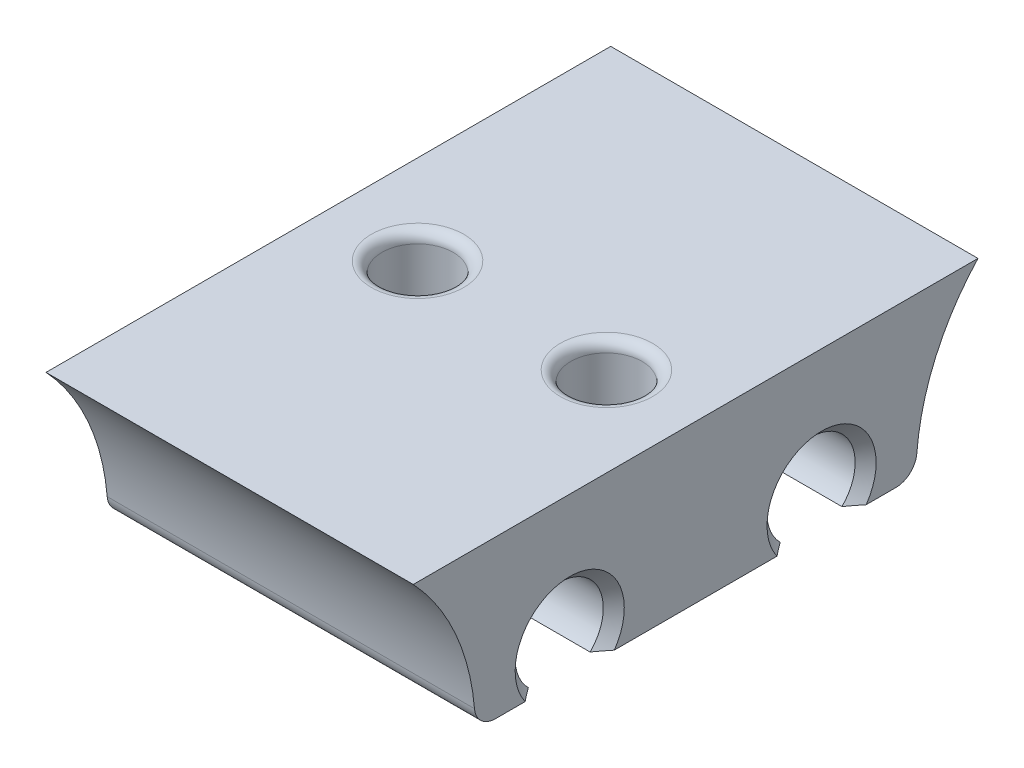
ISO-10303-21;
HEADER;
FILE_DESCRIPTION(('STEP AP214'),'2;1');
FILE_NAME('part.step','',(''),(''),'','','');
FILE_SCHEMA(('AUTOMOTIVE_DESIGN { 1 0 10303 214 1 1 1 1 }'));
ENDSEC;
DATA;
#1=APPLICATION_CONTEXT('core data for automotive mechanical design processes');
#2=APPLICATION_PROTOCOL_DEFINITION('international standard','automotive_design',2000,#1);
#3=PRODUCT_CONTEXT('',#1,'mechanical');
#4=PRODUCT('Part','Part','',(#3));
#5=PRODUCT_RELATED_PRODUCT_CATEGORY('part','',(#4));
#6=PRODUCT_DEFINITION_FORMATION('','',#4);
#7=PRODUCT_DEFINITION_CONTEXT('part definition',#1,'design');
#8=PRODUCT_DEFINITION('design','',#6,#7);
#9=PRODUCT_DEFINITION_SHAPE('','',#8);
#10=(LENGTH_UNIT() NAMED_UNIT(*) SI_UNIT(.MILLI.,.METRE.));
#11=(NAMED_UNIT(*) PLANE_ANGLE_UNIT() SI_UNIT($,.RADIAN.));
#12=(NAMED_UNIT(*) SI_UNIT($,.STERADIAN.) SOLID_ANGLE_UNIT());
#13=UNCERTAINTY_MEASURE_WITH_UNIT(LENGTH_MEASURE(1.E-05),#10,'distance_accuracy_value','');
#14=(GEOMETRIC_REPRESENTATION_CONTEXT(3) GLOBAL_UNCERTAINTY_ASSIGNED_CONTEXT((#13)) GLOBAL_UNIT_ASSIGNED_CONTEXT((#10,
#11,#12)) REPRESENTATION_CONTEXT('',''));
#15=CARTESIAN_POINT('',(0.,0.,0.));
#16=DIRECTION('',(0.,0.,1.));
#17=DIRECTION('',(1.,0.,0.));
#18=AXIS2_PLACEMENT_3D('',#15,#16,#17);
#19=CARTESIAN_POINT('',(8.75,-4.25,10.5));
#20=DIRECTION('',(-1.,0.,0.));
#21=DIRECTION('',(0.,0.,1.));
#22=AXIS2_PLACEMENT_3D('',#19,#20,#21);
#23=PLANE('',#22);
#24=DIRECTION('',(0.,0.,-1.));
#25=VECTOR('',#24,1.);
#26=CARTESIAN_POINT('',(8.75,-3.25,10.5));
#27=LINE('',#26,#25);
#28=CARTESIAN_POINT('',(8.75,-3.25,-8.12367605815953));
#29=VERTEX_POINT('',#28);
#30=CARTESIAN_POINT('',(8.75,-3.25,-9.5417392568986));
#31=VERTEX_POINT('',#30);
#32=EDGE_CURVE('E380',#29,#31,#27,.T.);
#33=ORIENTED_EDGE('',*,*,#32,.T.);
#34=CARTESIAN_POINT('',(8.75,-2.25,-9.5417392568986));
#35=DIRECTION('',(-1.,0.,0.));
#36=DIRECTION('',(0.,0.,1.));
#37=AXIS2_PLACEMENT_3D('',#34,#35,#36);
#38=CIRCLE('',#37,1.);
#39=CARTESIAN_POINT('',(8.75,-2.33333333333333,-10.5382609854904));
#40=VERTEX_POINT('',#39);
#41=EDGE_CURVE('E361',#31,#40,#38,.F.);
#42=ORIENTED_EDGE('',*,*,#41,.T.);
#43=CARTESIAN_POINT('',(8.75,-3.25,-21.5));
#44=DIRECTION('',(-1.,0.,0.));
#45=DIRECTION('',(0.,0.,1.));
#46=AXIS2_PLACEMENT_3D('',#43,#44,#45);
#47=CIRCLE('',#46,11.);
#48=CARTESIAN_POINT('',(8.75,4.25,-13.4532615302845));
#49=VERTEX_POINT('',#48);
#50=EDGE_CURVE('E150',#40,#49,#47,.T.);
#51=ORIENTED_EDGE('',*,*,#50,.T.);
#52=DIRECTION('',(0.,0.,-1.));
#53=VECTOR('',#52,1.);
#54=CARTESIAN_POINT('',(8.75,4.25,10.5));
#55=LINE('',#54,#53);
#56=CARTESIAN_POINT('',(8.75,4.24999999999998,13.4532615302845));
#57=VERTEX_POINT('',#56);
#58=EDGE_CURVE('E146',#57,#49,#55,.T.);
#59=ORIENTED_EDGE('',*,*,#58,.F.);
#60=CARTESIAN_POINT('',(8.75,-3.25000000000004,21.5));
#61=DIRECTION('',(-1.,0.,0.));
#62=DIRECTION('',(0.,0.,1.));
#63=AXIS2_PLACEMENT_3D('',#60,#61,#62);
#64=CIRCLE('',#63,11.);
#65=CARTESIAN_POINT('',(8.75,-2.33333333333334,10.5382609854904));
#66=VERTEX_POINT('',#65);
#67=EDGE_CURVE('E148',#57,#66,#64,.T.);
#68=ORIENTED_EDGE('',*,*,#67,.T.);
#69=CARTESIAN_POINT('',(8.75,-2.25,9.5417392568986));
#70=DIRECTION('',(-1.,0.,0.));
#71=DIRECTION('',(0.,0.,1.));
#72=AXIS2_PLACEMENT_3D('',#69,#70,#71);
#73=CIRCLE('',#72,1.);
#74=CARTESIAN_POINT('',(8.75,-3.25,9.5417392568986));
#75=VERTEX_POINT('',#74);
#76=EDGE_CURVE('E62',#66,#75,#73,.F.);
#77=ORIENTED_EDGE('',*,*,#76,.T.);
#78=CARTESIAN_POINT('',(8.75,-3.25,8.12367605815953));
#79=VERTEX_POINT('',#78);
#80=EDGE_CURVE('E279',#75,#79,#27,.T.);
#81=ORIENTED_EDGE('',*,*,#80,.T.);
#82=CARTESIAN_POINT('',(8.75,-1.75,6.));
#83=DIRECTION('',(-1.,0.,0.));
#84=DIRECTION('',(0.,0.,1.));
#85=AXIS2_PLACEMENT_3D('',#82,#83,#84);
#86=CIRCLE('',#85,2.6);
#87=CARTESIAN_POINT('',(8.75,-3.25,3.87632394184047));
#88=VERTEX_POINT('',#87);
#89=EDGE_CURVE('E302',#79,#88,#86,.T.);
#90=ORIENTED_EDGE('',*,*,#89,.T.);
#91=DIRECTION('',(0.,0.,-1.));
#92=VECTOR('',#91,1.);
#93=CARTESIAN_POINT('',(8.75,-3.25,3.40192378864668));
#94=LINE('',#93,#92);
#95=CARTESIAN_POINT('',(8.75,-3.25,-3.87632394184047));
#96=VERTEX_POINT('',#95);
#97=EDGE_CURVE('E291',#88,#96,#94,.T.);
#98=ORIENTED_EDGE('',*,*,#97,.T.);
#99=CARTESIAN_POINT('',(8.75,-1.75,-6.));
#100=DIRECTION('',(-1.,0.,0.));
#101=DIRECTION('',(0.,0.,1.));
#102=AXIS2_PLACEMENT_3D('',#99,#100,#101);
#103=CIRCLE('',#102,2.6);
#104=EDGE_CURVE('E298',#96,#29,#103,.T.);
#105=ORIENTED_EDGE('',*,*,#104,.T.);
#106=EDGE_LOOP('',(#33,#42,#51,#59,#68,#77,#81,#90,#98,#105));
#107=FACE_BOUND('',#106,.T.);
#108=ADVANCED_FACE('F46',(#107),#23,.F.);
#109=CARTESIAN_POINT('',(-8.75,4.25,10.5));
#110=DIRECTION('',(0.,-1.,0.));
#111=DIRECTION('',(0.,0.,-1.));
#112=AXIS2_PLACEMENT_3D('',#109,#110,#111);
#113=PLANE('',#112);
#114=CARTESIAN_POINT('',(-4.5,4.25,0.));
#115=DIRECTION('',(0.,-1.,0.));
#116=DIRECTION('',(0.,0.,-1.));
#117=AXIS2_PLACEMENT_3D('',#114,#115,#116);
#118=CIRCLE('',#117,2.2);
#119=CARTESIAN_POINT('',(-4.5,4.25,-2.2));
#120=VERTEX_POINT('',#119);
#121=EDGE_CURVE('E334',#120,#120,#118,.T.);
#122=ORIENTED_EDGE('',*,*,#121,.T.);
#123=EDGE_LOOP('',(#122));
#124=FACE_BOUND('',#123,.T.);
#125=CARTESIAN_POINT('',(4.5,4.25,0.));
#126=DIRECTION('',(0.,-1.,0.));
#127=DIRECTION('',(0.,0.,-1.));
#128=AXIS2_PLACEMENT_3D('',#125,#126,#127);
#129=CIRCLE('',#128,2.2);
#130=CARTESIAN_POINT('',(4.5,4.25,-2.19999999999999));
#131=VERTEX_POINT('',#130);
#132=EDGE_CURVE('E330',#131,#131,#129,.T.);
#133=ORIENTED_EDGE('',*,*,#132,.T.);
#134=EDGE_LOOP('',(#133));
#135=FACE_BOUND('',#134,.T.);
#136=ORIENTED_EDGE('',*,*,#58,.T.);
#137=DIRECTION('',(-1.,0.,0.));
#138=VECTOR('',#137,1.);
#139=CARTESIAN_POINT('',(16.8105057946917,4.25,-13.4532615302845));
#140=LINE('',#139,#138);
#141=CARTESIAN_POINT('',(-8.75,4.25,-13.4532615302845));
#142=VERTEX_POINT('',#141);
#143=EDGE_CURVE('E176',#49,#142,#140,.T.);
#144=ORIENTED_EDGE('',*,*,#143,.T.);
#145=DIRECTION('',(0.,0.,-1.));
#146=VECTOR('',#145,1.);
#147=CARTESIAN_POINT('',(-8.75,4.25,10.5));
#148=LINE('',#147,#146);
#149=CARTESIAN_POINT('',(-8.75,4.24999999999998,13.4532615302845));
#150=VERTEX_POINT('',#149);
#151=EDGE_CURVE('E157',#150,#142,#148,.T.);
#152=ORIENTED_EDGE('',*,*,#151,.F.);
#153=DIRECTION('',(-1.,0.,0.));
#154=VECTOR('',#153,1.);
#155=CARTESIAN_POINT('',(16.8105057946917,4.24999999999998,13.4532615302845));
#156=LINE('',#155,#154);
#157=EDGE_CURVE('E161',#57,#150,#156,.T.);
#158=ORIENTED_EDGE('',*,*,#157,.F.);
#159=EDGE_LOOP('',(#136,#144,#152,#158));
#160=FACE_BOUND('',#159,.T.);
#161=ADVANCED_FACE('F165',(#124,#135,#160),#113,.F.);
#162=CARTESIAN_POINT('',(-8.75,-4.25,10.5));
#163=DIRECTION('',(1.,0.,0.));
#164=DIRECTION('',(0.,0.,-1.));
#165=AXIS2_PLACEMENT_3D('',#162,#163,#164);
#166=PLANE('',#165);
#167=CARTESIAN_POINT('',(-8.75,-3.25,-21.5));
#168=DIRECTION('',(1.,0.,0.));
#169=DIRECTION('',(0.,0.,1.));
#170=AXIS2_PLACEMENT_3D('',#167,#168,#169);
#171=CIRCLE('',#170,11.);
#172=CARTESIAN_POINT('',(-8.75,-2.33333333333333,-10.5382609854904));
#173=VERTEX_POINT('',#172);
#174=EDGE_CURVE('E170',#142,#173,#171,.T.);
#175=ORIENTED_EDGE('',*,*,#174,.T.);
#176=CARTESIAN_POINT('',(-8.75,-2.25,-9.5417392568986));
#177=DIRECTION('',(1.,0.,0.));
#178=DIRECTION('',(0.,0.,-1.));
#179=AXIS2_PLACEMENT_3D('',#176,#177,#178);
#180=CIRCLE('',#179,1.);
#181=CARTESIAN_POINT('',(-8.75,-3.25,-9.5417392568986));
#182=VERTEX_POINT('',#181);
#183=EDGE_CURVE('E353',#173,#182,#180,.F.);
#184=ORIENTED_EDGE('',*,*,#183,.T.);
#185=DIRECTION('',(0.,0.,1.));
#186=VECTOR('',#185,1.);
#187=CARTESIAN_POINT('',(-8.75,-3.25,10.5));
#188=LINE('',#187,#186);
#189=CARTESIAN_POINT('',(-8.75,-3.25,-8.12367605815953));
#190=VERTEX_POINT('',#189);
#191=EDGE_CURVE('E374',#182,#190,#188,.T.);
#192=ORIENTED_EDGE('',*,*,#191,.T.);
#193=CARTESIAN_POINT('',(-8.75,-1.75,-6.));
#194=DIRECTION('',(1.,0.,0.));
#195=DIRECTION('',(0.,0.,-1.));
#196=AXIS2_PLACEMENT_3D('',#193,#194,#195);
#197=CIRCLE('',#196,2.6);
#198=CARTESIAN_POINT('',(-8.75,-3.25,-3.87632394184047));
#199=VERTEX_POINT('',#198);
#200=EDGE_CURVE('E322',#190,#199,#197,.T.);
#201=ORIENTED_EDGE('',*,*,#200,.T.);
#202=DIRECTION('',(0.,0.,-1.));
#203=VECTOR('',#202,1.);
#204=CARTESIAN_POINT('',(-8.75,-3.25,10.5));
#205=LINE('',#204,#203);
#206=CARTESIAN_POINT('',(-8.75,-3.25,3.87632394184047));
#207=VERTEX_POINT('',#206);
#208=EDGE_CURVE('E156',#199,#207,#205,.F.);
#209=ORIENTED_EDGE('',*,*,#208,.T.);
#210=CARTESIAN_POINT('',(-8.75,-1.75,6.));
#211=DIRECTION('',(1.,0.,0.));
#212=DIRECTION('',(0.,0.,-1.));
#213=AXIS2_PLACEMENT_3D('',#210,#211,#212);
#214=CIRCLE('',#213,2.6);
#215=CARTESIAN_POINT('',(-8.75,-3.25,8.12367605815953));
#216=VERTEX_POINT('',#215);
#217=EDGE_CURVE('E326',#207,#216,#214,.T.);
#218=ORIENTED_EDGE('',*,*,#217,.T.);
#219=CARTESIAN_POINT('',(-8.75,-3.25,9.5417392568986));
#220=VERTEX_POINT('',#219);
#221=EDGE_CURVE('E273',#216,#220,#188,.T.);
#222=ORIENTED_EDGE('',*,*,#221,.T.);
#223=CARTESIAN_POINT('',(-8.75,-2.25,9.5417392568986));
#224=DIRECTION('',(1.,0.,0.));
#225=DIRECTION('',(0.,0.,-1.));
#226=AXIS2_PLACEMENT_3D('',#223,#224,#225);
#227=CIRCLE('',#226,1.);
#228=CARTESIAN_POINT('',(-8.75,-2.33333333333334,10.5382609854904));
#229=VERTEX_POINT('',#228);
#230=EDGE_CURVE('E350',#220,#229,#227,.F.);
#231=ORIENTED_EDGE('',*,*,#230,.T.);
#232=CARTESIAN_POINT('',(-8.75,-3.25000000000004,21.5));
#233=DIRECTION('',(1.,0.,0.));
#234=DIRECTION('',(0.,0.,-1.));
#235=AXIS2_PLACEMENT_3D('',#232,#233,#234);
#236=CIRCLE('',#235,11.);
#237=EDGE_CURVE('E167',#229,#150,#236,.T.);
#238=ORIENTED_EDGE('',*,*,#237,.T.);
#239=ORIENTED_EDGE('',*,*,#151,.T.);
#240=EDGE_LOOP('',(#175,#184,#192,#201,#209,#218,#222,#231,#238,#239));
#241=FACE_BOUND('',#240,.T.);
#242=ADVANCED_FACE('F371',(#241),#166,.F.);
#243=CARTESIAN_POINT('',(8.75,-3.25,3.40192378864668));
#244=DIRECTION('',(0.,1.,0.));
#245=DIRECTION('',(0.,0.,1.));
#246=AXIS2_PLACEMENT_3D('',#243,#244,#245);
#247=PLANE('',#246);
#248=CARTESIAN_POINT('',(-4.5,-3.25,0.));
#249=DIRECTION('',(0.,-1.,0.));
#250=DIRECTION('',(0.,0.,-1.));
#251=AXIS2_PLACEMENT_3D('',#248,#249,#250);
#252=CIRCLE('',#251,3.15);
#253=CARTESIAN_POINT('',(-4.5,-3.25,-3.15));
#254=VERTEX_POINT('',#253);
#255=EDGE_CURVE('E274',#254,#254,#252,.T.);
#256=ORIENTED_EDGE('',*,*,#255,.F.);
#257=EDGE_LOOP('',(#256));
#258=FACE_BOUND('',#257,.T.);
#259=CARTESIAN_POINT('',(4.5,-3.25,0.));
#260=DIRECTION('',(0.,-1.,0.));
#261=DIRECTION('',(0.,0.,-1.));
#262=AXIS2_PLACEMENT_3D('',#259,#260,#261);
#263=CIRCLE('',#262,3.15);
#264=CARTESIAN_POINT('',(4.5,-3.25,-3.14999999999999));
#265=VERTEX_POINT('',#264);
#266=EDGE_CURVE('E283',#265,#265,#263,.T.);
#267=ORIENTED_EDGE('',*,*,#266,.F.);
#268=EDGE_LOOP('',(#267));
#269=FACE_BOUND('',#268,.T.);
#270=ORIENTED_EDGE('',*,*,#208,.F.);
#271=CARTESIAN_POINT('',(-8.86492282488694,-3.25,-3.7370802168234));
#272=CARTESIAN_POINT('',(-8.80214262063256,-3.25,-3.8124487679703));
#273=CARTESIAN_POINT('',(-8.73987510337758,-3.25,-3.8882591515387));
#274=CARTESIAN_POINT('',(-8.61677880199909,-3.25,-4.04114521396671));
#275=CARTESIAN_POINT('',(-8.55595131260318,-3.25,-4.11822193324749));
#276=CARTESIAN_POINT('',(-8.43482314261844,-3.25,-4.27576005152315));
#277=CARTESIAN_POINT('',(-8.37457011335727,-3.25,-4.35625828926062));
#278=CARTESIAN_POINT('',(-8.25694818631533,-3.25,-4.51931363639384));
#279=CARTESIAN_POINT('',(-8.19957831148569,-3.25,-4.6018700339329));
#280=CARTESIAN_POINT('',(-8.10202566005274,-3.25,-4.74991139358711));
#281=CARTESIAN_POINT('',(-8.06098253490809,-3.25,-4.81482597124186));
#282=CARTESIAN_POINT('',(-7.98214315282961,-3.25,-4.94664997937227));
#283=CARTESIAN_POINT('',(-7.94434812447959,-3.25,-5.0135601518982));
#284=CARTESIAN_POINT('',(-7.87346908292859,-3.25,-5.14931216691507));
#285=CARTESIAN_POINT('',(-7.84035570466208,-3.25,-5.2181384000628));
#286=CARTESIAN_POINT('',(-7.78023902694773,-3.25,-5.35836261639145));
#287=CARTESIAN_POINT('',(-7.75322994057454,-3.25,-5.42975808882579));
#288=CARTESIAN_POINT('',(-7.70257330703211,-3.25,-5.59081030485194));
#289=CARTESIAN_POINT('',(-7.6808637060653,-3.25,-5.68112036481961));
#290=CARTESIAN_POINT('',(-7.66029568282809,-3.25,-5.81821297057257));
#291=CARTESIAN_POINT('',(-7.65543772366721,-3.25,-5.86412509444855));
#292=CARTESIAN_POINT('',(-7.64993732558307,-3.25,-5.95621081003121));
#293=CARTESIAN_POINT('',(-7.64929472024012,-3.25,-6.00238439134368));
#294=CARTESIAN_POINT('',(-7.65227328465313,-3.25,-6.09462330079769));
#295=CARTESIAN_POINT('',(-7.655897547603,-3.25,-6.14068852611917));
#296=CARTESIAN_POINT('',(-7.66720280014173,-3.25,-6.23232047262246));
#297=CARTESIAN_POINT('',(-7.67488466600291,-3.25,-6.27788708395406));
#298=CARTESIAN_POINT('',(-7.69394162754968,-3.25,-6.36840608832551));
#299=CARTESIAN_POINT('',(-7.70533022482641,-3.25,-6.41335560016437));
#300=CARTESIAN_POINT('',(-7.73129882707193,-3.25,-6.50230908165516));
#301=CARTESIAN_POINT('',(-7.74587884712391,-3.25,-6.5463130468372));
#302=CARTESIAN_POINT('',(-7.79974463124579,-3.25,-6.69354272546137));
#303=CARTESIAN_POINT('',(-7.84530268981728,-3.25,-6.7944713974307));
#304=CARTESIAN_POINT('',(-7.94603938477362,-3.25,-6.99143721540323));
#305=CARTESIAN_POINT('',(-8.00123957381321,-3.25,-7.08746276671709));
#306=CARTESIAN_POINT('',(-8.11811622726069,-3.25,-7.27632205599427));
#307=CARTESIAN_POINT('',(-8.17983317696649,-3.25,-7.36913043144006));
#308=CARTESIAN_POINT('',(-8.30726505368208,-3.25,-7.55179264545325));
#309=CARTESIAN_POINT('',(-8.3729762390944,-3.25,-7.64164913123798));
#310=CARTESIAN_POINT('',(-8.50893660075259,-3.25,-7.82157585417414));
#311=CARTESIAN_POINT('',(-8.57925956212789,-3.25,-7.91159002466336));
#312=CARTESIAN_POINT('',(-8.68587585102529,-3.25,-8.04483703940083));
#313=CARTESIAN_POINT('',(-8.72138782981141,-3.25,-8.08870017302211));
#314=CARTESIAN_POINT('',(-8.79284608676017,-3.25,-8.17606656588344));
#315=CARTESIAN_POINT('',(-8.82879233595693,-3.25,-8.21956984880305));
#316=CARTESIAN_POINT('',(-8.86492282488694,-3.25,-8.2629197831766));
#317=B_SPLINE_CURVE_WITH_KNOTS('',3,(#271,#272,#273,#274,#275,#276,#277,#278,#279,#280,#281,
#282,#283,#284,#285,#286,#287,#288,#289,#290,#291,#292,#293,#294,#295,#296,#297,#298,#299,#300,
#301,#302,#303,#304,#305,#306,#307,#308,#309,#310,#311,#312,#313,#314,#315,#316),.UNSPECIFIED.,
.F.,.F.,(4,2,2,2,2,2,2,2,2,2,2,2,2,2,2,2,2,2,2,2,2,2,4),(0.,0.294286830158348,0.58882890977384,
0.890437544718664,1.19194327104146,1.42227737121642,1.6526982146659,1.88160272630474,
2.11028931550749,2.38763326068843,2.52597009022561,2.6643014582727,2.80273316908167,
2.94119478757322,3.08016649827269,3.21913886578934,3.55038741803754,3.88238609938811,
4.21658443060272,4.55047438730178,4.89311121055649,5.06241870980234,5.23171497788639),.UNSPECIFIED.);
#318=CARTESIAN_POINT('',(-8.25000000000002,-3.25,-4.53030615433004));
#319=VERTEX_POINT('',#318);
#320=EDGE_CURVE('E192',#199,#319,#317,.T.);
#321=ORIENTED_EDGE('',*,*,#320,.T.);
#322=DIRECTION('',(-1.,0.,0.));
#323=VECTOR('',#322,1.);
#324=CARTESIAN_POINT('',(8.75,-3.25,-4.53030615433009));
#325=LINE('',#324,#323);
#326=CARTESIAN_POINT('',(8.24999999999999,-3.25,-4.53030615433009));
#327=VERTEX_POINT('',#326);
#328=EDGE_CURVE('E235',#327,#319,#325,.T.);
#329=ORIENTED_EDGE('',*,*,#328,.F.);
#330=CARTESIAN_POINT('',(8.86492282488693,-3.25,-8.2629197831766));
#331=CARTESIAN_POINT('',(8.80214262063255,-3.25,-8.1875512320297));
#332=CARTESIAN_POINT('',(8.73987510337757,-3.25,-8.11174084846131));
#333=CARTESIAN_POINT('',(8.61677880199908,-3.25,-7.95885478603329));
#334=CARTESIAN_POINT('',(8.55595131260317,-3.25,-7.88177806675252));
#335=CARTESIAN_POINT('',(8.43482314261843,-3.25,-7.72423994847685));
#336=CARTESIAN_POINT('',(8.37457011335726,-3.25,-7.64374171073939));
#337=CARTESIAN_POINT('',(8.25694818631532,-3.25,-7.48068636360617));
#338=CARTESIAN_POINT('',(8.19957831148568,-3.25,-7.39812996606711));
#339=CARTESIAN_POINT('',(8.10202566005274,-3.25,-7.25008860641289));
#340=CARTESIAN_POINT('',(8.06098253490809,-3.25,-7.18517402875815));
#341=CARTESIAN_POINT('',(7.9821431528296,-3.25,-7.05335002062774));
#342=CARTESIAN_POINT('',(7.94434812447958,-3.25,-6.9864398481018));
#343=CARTESIAN_POINT('',(7.87346908292858,-3.25,-6.85068783308493));
#344=CARTESIAN_POINT('',(7.84035570466208,-3.25,-6.78186159993721));
#345=CARTESIAN_POINT('',(7.78023902694772,-3.25,-6.64163738360855));
#346=CARTESIAN_POINT('',(7.75322994057453,-3.25,-6.57024191117421));
#347=CARTESIAN_POINT('',(7.7025733070321,-3.25,-6.40918969514805));
#348=CARTESIAN_POINT('',(7.68086370606529,-3.25,-6.31887963518039));
#349=CARTESIAN_POINT('',(7.66029568282808,-3.25,-6.18178702942743));
#350=CARTESIAN_POINT('',(7.65543772366719,-3.25,-6.13587490555145));
#351=CARTESIAN_POINT('',(7.64993732558306,-3.25,-6.04378918996878));
#352=CARTESIAN_POINT('',(7.64929472024011,-3.25,-5.99761560865631));
#353=CARTESIAN_POINT('',(7.65227328465312,-3.25,-5.90537669920231));
#354=CARTESIAN_POINT('',(7.65589754760299,-3.25,-5.85931147388083));
#355=CARTESIAN_POINT('',(7.66720280014172,-3.25,-5.76767952737754));
#356=CARTESIAN_POINT('',(7.6748846660029,-3.25,-5.72211291604594));
#357=CARTESIAN_POINT('',(7.69394162754967,-3.25,-5.63159391167449));
#358=CARTESIAN_POINT('',(7.7053302248264,-3.25,-5.58664439983562));
#359=CARTESIAN_POINT('',(7.73129882707192,-3.25,-5.49769091834483));
#360=CARTESIAN_POINT('',(7.7458788471239,-3.25,-5.4536869531628));
#361=CARTESIAN_POINT('',(7.79974463124578,-3.25,-5.30645727453862));
#362=CARTESIAN_POINT('',(7.84530268981727,-3.25,-5.20552860256929));
#363=CARTESIAN_POINT('',(7.94603938477361,-3.25,-5.00856278459677));
#364=CARTESIAN_POINT('',(8.0012395738132,-3.25,-4.9125372332829));
#365=CARTESIAN_POINT('',(8.11811622726069,-3.25,-4.72367794400572));
#366=CARTESIAN_POINT('',(8.17983317696648,-3.25,-4.63086956855993));
#367=CARTESIAN_POINT('',(8.30726505368207,-3.25,-4.44820735454674));
#368=CARTESIAN_POINT('',(8.37297623909439,-3.25,-4.35835086876201));
#369=CARTESIAN_POINT('',(8.50893660075259,-3.25,-4.17842414582585));
#370=CARTESIAN_POINT('',(8.57925956212789,-3.25,-4.08840997533664));
#371=CARTESIAN_POINT('',(8.68587585102529,-3.25,-3.95516296059917));
#372=CARTESIAN_POINT('',(8.7213878298114,-3.25,-3.91129982697789));
#373=CARTESIAN_POINT('',(8.79284608676016,-3.25,-3.82393343411656));
#374=CARTESIAN_POINT('',(8.82879233595692,-3.25,-3.78043015119694));
#375=CARTESIAN_POINT('',(8.86492282488693,-3.25,-3.7370802168234));
#376=B_SPLINE_CURVE_WITH_KNOTS('',3,(#330,#331,#332,#333,#334,#335,#336,#337,#338,#339,#340,
#341,#342,#343,#344,#345,#346,#347,#348,#349,#350,#351,#352,#353,#354,#355,#356,#357,#358,#359,
#360,#361,#362,#363,#364,#365,#366,#367,#368,#369,#370,#371,#372,#373,#374,#375),.UNSPECIFIED.,
.F.,.F.,(4,2,2,2,2,2,2,2,2,2,2,2,2,2,2,2,2,2,2,2,2,2,4),(0.,0.294286830158346,0.588828909773839,
0.890437544718663,1.19194327104146,1.42227737121642,1.6526982146659,1.88160272630474,
2.1102893155075,2.38763326068843,2.52597009022561,2.66430145827271,2.80273316908168,
2.94119478757323,3.0801664982727,3.21913886578934,3.55038741803755,3.88238609938812,
4.21658443060273,4.5504743873018,4.8931112105565,5.06241870980235,5.23171497788639),.UNSPECIFIED.);
#377=EDGE_CURVE('E233',#327,#96,#376,.T.);
#378=ORIENTED_EDGE('',*,*,#377,.T.);
#379=ORIENTED_EDGE('',*,*,#97,.F.);
#380=CARTESIAN_POINT('',(8.86492282488693,-3.25,3.7370802168234));
#381=CARTESIAN_POINT('',(8.80214262063255,-3.25,3.8124487679703));
#382=CARTESIAN_POINT('',(8.73987510337757,-3.25,3.8882591515387));
#383=CARTESIAN_POINT('',(8.61677880199908,-3.25,4.04114521396671));
#384=CARTESIAN_POINT('',(8.55595131260317,-3.25,4.11822193324748));
#385=CARTESIAN_POINT('',(8.43482314261843,-3.25,4.27576005152315));
#386=CARTESIAN_POINT('',(8.37457011335726,-3.25,4.35625828926062));
#387=CARTESIAN_POINT('',(8.25694818631532,-3.25,4.51931363639383));
#388=CARTESIAN_POINT('',(8.19957831148568,-3.25,4.60187003393289));
#389=CARTESIAN_POINT('',(8.10202566005274,-3.25,4.74991139358711));
#390=CARTESIAN_POINT('',(8.06098253490809,-3.25,4.81482597124185));
#391=CARTESIAN_POINT('',(7.9821431528296,-3.25,4.94664997937226));
#392=CARTESIAN_POINT('',(7.94434812447958,-3.25,5.0135601518982));
#393=CARTESIAN_POINT('',(7.87346908292858,-3.25,5.14931216691507));
#394=CARTESIAN_POINT('',(7.84035570466208,-3.25,5.21813840006279));
#395=CARTESIAN_POINT('',(7.78023902694772,-3.25,5.35836261639145));
#396=CARTESIAN_POINT('',(7.75322994057453,-3.25,5.42975808882579));
#397=CARTESIAN_POINT('',(7.7025733070321,-3.25,5.59081030485194));
#398=CARTESIAN_POINT('',(7.68086370606529,-3.25,5.68112036481961));
#399=CARTESIAN_POINT('',(7.66029568282808,-3.25,5.81821297057257));
#400=CARTESIAN_POINT('',(7.65543772366719,-3.25,5.86412509444855));
#401=CARTESIAN_POINT('',(7.64993732558306,-3.25,5.95621081003121));
#402=CARTESIAN_POINT('',(7.64929472024011,-3.25,6.00238439134368));
#403=CARTESIAN_POINT('',(7.65227328465312,-3.25,6.09462330079769));
#404=CARTESIAN_POINT('',(7.65589754760299,-3.25,6.14068852611917));
#405=CARTESIAN_POINT('',(7.66720280014172,-3.25,6.23232047262245));
#406=CARTESIAN_POINT('',(7.6748846660029,-3.25,6.27788708395406));
#407=CARTESIAN_POINT('',(7.69394162754967,-3.25,6.36840608832551));
#408=CARTESIAN_POINT('',(7.70533022482639,-3.25,6.41335560016437));
#409=CARTESIAN_POINT('',(7.73129882707192,-3.25,6.50230908165516));
#410=CARTESIAN_POINT('',(7.7458788471239,-3.25,6.5463130468372));
#411=CARTESIAN_POINT('',(7.79974463124578,-3.25,6.69354272546137));
#412=CARTESIAN_POINT('',(7.84530268981727,-3.25,6.7944713974307));
#413=CARTESIAN_POINT('',(7.94603938477361,-3.25,6.99143721540323));
#414=CARTESIAN_POINT('',(8.0012395738132,-3.25,7.08746276671709));
#415=CARTESIAN_POINT('',(8.11811622726068,-3.25,7.27632205599427));
#416=CARTESIAN_POINT('',(8.17983317696648,-3.25,7.36913043144006));
#417=CARTESIAN_POINT('',(8.30726505368207,-3.25,7.55179264545325));
#418=CARTESIAN_POINT('',(8.37297623909439,-3.25,7.64164913123798));
#419=CARTESIAN_POINT('',(8.50893660075258,-3.25,7.82157585417414));
#420=CARTESIAN_POINT('',(8.57925956212788,-3.25,7.91159002466336));
#421=CARTESIAN_POINT('',(8.68587585102529,-3.25,8.04483703940083));
#422=CARTESIAN_POINT('',(8.7213878298114,-3.25,8.08870017302211));
#423=CARTESIAN_POINT('',(8.79284608676016,-3.25,8.17606656588344));
#424=CARTESIAN_POINT('',(8.82879233595692,-3.25,8.21956984880306));
#425=CARTESIAN_POINT('',(8.86492282488693,-3.25,8.2629197831766));
#426=B_SPLINE_CURVE_WITH_KNOTS('',3,(#380,#381,#382,#383,#384,#385,#386,#387,#388,#389,#390,
#391,#392,#393,#394,#395,#396,#397,#398,#399,#400,#401,#402,#403,#404,#405,#406,#407,#408,#409,
#410,#411,#412,#413,#414,#415,#416,#417,#418,#419,#420,#421,#422,#423,#424,#425),.UNSPECIFIED.,
.F.,.F.,(4,2,2,2,2,2,2,2,2,2,2,2,2,2,2,2,2,2,2,2,2,2,4),(0.,0.294286830158348,0.58882890977384,
0.890437544718662,1.19194327104146,1.42227737121642,1.6526982146659,1.88160272630474,
2.11028931550749,2.38763326068843,2.52597009022561,2.6643014582727,2.80273316908168,
2.94119478757323,3.0801664982727,3.21913886578934,3.55038741803755,3.88238609938811,
4.21658443060272,4.55047438730179,4.8931112105565,5.06241870980235,5.23171497788639),.UNSPECIFIED.);
#427=CARTESIAN_POINT('',(8.25,-3.25,4.53030615433005));
#428=VERTEX_POINT('',#427);
#429=EDGE_CURVE('E223',#88,#428,#426,.T.);
#430=ORIENTED_EDGE('',*,*,#429,.T.);
#431=DIRECTION('',(-1.,0.,0.));
#432=VECTOR('',#431,1.);
#433=CARTESIAN_POINT('',(8.75,-3.25,4.5303061543301));
#434=LINE('',#433,#432);
#435=CARTESIAN_POINT('',(-8.25,-3.25,4.5303061543301));
#436=VERTEX_POINT('',#435);
#437=EDGE_CURVE('E232',#436,#428,#434,.F.);
#438=ORIENTED_EDGE('',*,*,#437,.F.);
#439=CARTESIAN_POINT('',(-8.86492282488694,-3.25,8.2629197831766));
#440=CARTESIAN_POINT('',(-8.80214262063255,-3.25,8.1875512320297));
#441=CARTESIAN_POINT('',(-8.73987510337758,-3.25,8.1117408484613));
#442=CARTESIAN_POINT('',(-8.61677880199909,-3.25,7.95885478603329));
#443=CARTESIAN_POINT('',(-8.55595131260318,-3.25,7.88177806675251));
#444=CARTESIAN_POINT('',(-8.43482314261844,-3.25,7.72423994847684));
#445=CARTESIAN_POINT('',(-8.37457011335727,-3.25,7.64374171073938));
#446=CARTESIAN_POINT('',(-8.25694818631533,-3.25,7.48068636360616));
#447=CARTESIAN_POINT('',(-8.19957831148569,-3.25,7.3981299660671));
#448=CARTESIAN_POINT('',(-8.10202566005274,-3.25,7.25008860641288));
#449=CARTESIAN_POINT('',(-8.06098253490809,-3.25,7.18517402875814));
#450=CARTESIAN_POINT('',(-7.98214315282961,-3.25,7.05335002062773));
#451=CARTESIAN_POINT('',(-7.94434812447959,-3.25,6.9864398481018));
#452=CARTESIAN_POINT('',(-7.87346908292859,-3.25,6.85068783308493));
#453=CARTESIAN_POINT('',(-7.84035570466209,-3.25,6.7818615999372));
#454=CARTESIAN_POINT('',(-7.78023902694773,-3.25,6.64163738360855));
#455=CARTESIAN_POINT('',(-7.75322994057454,-3.25,6.57024191117421));
#456=CARTESIAN_POINT('',(-7.70257330703212,-3.25,6.40918969514806));
#457=CARTESIAN_POINT('',(-7.6808637060653,-3.25,6.31887963518039));
#458=CARTESIAN_POINT('',(-7.66029568282809,-3.25,6.18178702942743));
#459=CARTESIAN_POINT('',(-7.65543772366721,-3.25,6.13587490555145));
#460=CARTESIAN_POINT('',(-7.64993732558308,-3.25,6.04378918996879));
#461=CARTESIAN_POINT('',(-7.64929472024012,-3.25,5.99761560865632));
#462=CARTESIAN_POINT('',(-7.65227328465314,-3.25,5.90537669920231));
#463=CARTESIAN_POINT('',(-7.655897547603,-3.25,5.85931147388083));
#464=CARTESIAN_POINT('',(-7.66720280014174,-3.25,5.76767952737754));
#465=CARTESIAN_POINT('',(-7.67488466600291,-3.25,5.72211291604594));
#466=CARTESIAN_POINT('',(-7.69394162754968,-3.25,5.6315939116745));
#467=CARTESIAN_POINT('',(-7.70533022482641,-3.25,5.58664439983563));
#468=CARTESIAN_POINT('',(-7.73129882707193,-3.25,5.49769091834484));
#469=CARTESIAN_POINT('',(-7.74587884712391,-3.25,5.4536869531628));
#470=CARTESIAN_POINT('',(-7.79974463124579,-3.25,5.30645727453862));
#471=CARTESIAN_POINT('',(-7.84530268981729,-3.25,5.20552860256929));
#472=CARTESIAN_POINT('',(-7.94603938477362,-3.25,5.00856278459677));
#473=CARTESIAN_POINT('',(-8.00123957381322,-3.25,4.9125372332829));
#474=CARTESIAN_POINT('',(-8.1181162272607,-3.25,4.72367794400573));
#475=CARTESIAN_POINT('',(-8.1798331769665,-3.25,4.63086956855993));
#476=CARTESIAN_POINT('',(-8.30726505368209,-3.25,4.44820735454674));
#477=CARTESIAN_POINT('',(-8.3729762390944,-3.25,4.35835086876202));
#478=CARTESIAN_POINT('',(-8.50893660075259,-3.25,4.17842414582586));
#479=CARTESIAN_POINT('',(-8.57925956212789,-3.25,4.08840997533664));
#480=CARTESIAN_POINT('',(-8.68587585102529,-3.25,3.95516296059917));
#481=CARTESIAN_POINT('',(-8.72138782981141,-3.25,3.91129982697789));
#482=CARTESIAN_POINT('',(-8.79284608676017,-3.25,3.82393343411656));
#483=CARTESIAN_POINT('',(-8.82879233595693,-3.25,3.78043015119695));
#484=CARTESIAN_POINT('',(-8.86492282488694,-3.25,3.7370802168234));
#485=B_SPLINE_CURVE_WITH_KNOTS('',3,(#439,#440,#441,#442,#443,#444,#445,#446,#447,#448,#449,
#450,#451,#452,#453,#454,#455,#456,#457,#458,#459,#460,#461,#462,#463,#464,#465,#466,#467,#468,
#469,#470,#471,#472,#473,#474,#475,#476,#477,#478,#479,#480,#481,#482,#483,#484),.UNSPECIFIED.,
.F.,.F.,(4,2,2,2,2,2,2,2,2,2,2,2,2,2,2,2,2,2,2,2,2,2,4),(0.,0.294286830158348,0.588828909773841,
0.890437544718665,1.19194327104147,1.42227737121643,1.6526982146659,1.88160272630474,
2.11028931550749,2.38763326068842,2.5259700902256,2.6643014582727,2.80273316908167,
2.94119478757322,3.08016649827269,3.21913886578933,3.55038741803754,3.88238609938811,
4.21658443060272,4.55047438730179,4.89311121055649,5.06241870980234,5.23171497788638),.UNSPECIFIED.);
#486=EDGE_CURVE('E260',#436,#207,#485,.T.);
#487=ORIENTED_EDGE('',*,*,#486,.T.);
#488=EDGE_LOOP('',(#270,#321,#329,#378,#379,#430,#438,#487));
#489=FACE_BOUND('',#488,.T.);
#490=ADVANCED_FACE('F405',(#258,#269,#489),#247,.F.);
#491=CARTESIAN_POINT('',(8.75,-1.75,6.));
#492=DIRECTION('',(-1.,0.,0.));
#493=DIRECTION('',(0.,0.,1.));
#494=AXIS2_PLACEMENT_3D('',#491,#492,#493);
#495=CYLINDRICAL_SURFACE('',#494,2.1);
#496=CARTESIAN_POINT('',(-8.25,-1.75,6.));
#497=DIRECTION('',(1.,0.,0.));
#498=DIRECTION('',(0.,0.,-1.));
#499=AXIS2_PLACEMENT_3D('',#496,#497,#498);
#500=CIRCLE('',#499,2.1);
#501=CARTESIAN_POINT('',(-8.25000000000002,-3.25,7.46969384566995));
#502=VERTEX_POINT('',#501);
#503=EDGE_CURVE('E306',#502,#436,#500,.F.);
#504=ORIENTED_EDGE('',*,*,#503,.T.);
#505=ORIENTED_EDGE('',*,*,#437,.T.);
#506=CARTESIAN_POINT('',(8.24999999999999,-1.75,6.));
#507=DIRECTION('',(-1.,0.,0.));
#508=DIRECTION('',(0.,0.,1.));
#509=AXIS2_PLACEMENT_3D('',#506,#507,#508);
#510=CIRCLE('',#509,2.1);
#511=CARTESIAN_POINT('',(8.24999999999999,-3.25,7.4696938456699));
#512=VERTEX_POINT('',#511);
#513=EDGE_CURVE('E310',#428,#512,#510,.F.);
#514=ORIENTED_EDGE('',*,*,#513,.T.);
#515=DIRECTION('',(-1.,0.,0.));
#516=VECTOR('',#515,1.);
#517=CARTESIAN_POINT('',(8.75,-3.25,7.4696938456699));
#518=LINE('',#517,#516);
#519=EDGE_CURVE('E269',#512,#502,#518,.T.);
#520=ORIENTED_EDGE('',*,*,#519,.T.);
#521=EDGE_LOOP('',(#504,#505,#514,#520));
#522=FACE_BOUND('',#521,.T.);
#523=ADVANCED_FACE('F408',(#522),#495,.F.);
#524=CARTESIAN_POINT('',(8.75,-1.75,-6.));
#525=DIRECTION('',(-1.,0.,0.));
#526=DIRECTION('',(0.,0.,1.));
#527=AXIS2_PLACEMENT_3D('',#524,#525,#526);
#528=CYLINDRICAL_SURFACE('',#527,2.1);
#529=CARTESIAN_POINT('',(-8.25,-1.75,-6.));
#530=DIRECTION('',(1.,0.,0.));
#531=DIRECTION('',(0.,0.,-1.));
#532=AXIS2_PLACEMENT_3D('',#529,#530,#531);
#533=CIRCLE('',#532,2.1);
#534=CARTESIAN_POINT('',(-8.25,-3.25,-7.46969384566991));
#535=VERTEX_POINT('',#534);
#536=EDGE_CURVE('E314',#319,#535,#533,.F.);
#537=ORIENTED_EDGE('',*,*,#536,.T.);
#538=DIRECTION('',(-1.,0.,0.));
#539=VECTOR('',#538,1.);
#540=CARTESIAN_POINT('',(8.75,-3.25,-7.46969384566991));
#541=LINE('',#540,#539);
#542=CARTESIAN_POINT('',(8.24999999999999,-3.25,-7.46969384566991));
#543=VERTEX_POINT('',#542);
#544=EDGE_CURVE('E191',#535,#543,#541,.F.);
#545=ORIENTED_EDGE('',*,*,#544,.T.);
#546=CARTESIAN_POINT('',(8.24999999999999,-1.75,-6.));
#547=DIRECTION('',(-1.,0.,0.));
#548=DIRECTION('',(0.,0.,1.));
#549=AXIS2_PLACEMENT_3D('',#546,#547,#548);
#550=CIRCLE('',#549,2.1);
#551=EDGE_CURVE('E318',#543,#327,#550,.F.);
#552=ORIENTED_EDGE('',*,*,#551,.T.);
#553=ORIENTED_EDGE('',*,*,#328,.T.);
#554=EDGE_LOOP('',(#537,#545,#552,#553));
#555=FACE_BOUND('',#554,.T.);
#556=ADVANCED_FACE('F245',(#555),#528,.F.);
#557=CARTESIAN_POINT('',(8.75,-1.75,6.));
#558=DIRECTION('',(1.,0.,0.));
#559=DIRECTION('',(0.,0.,-1.));
#560=AXIS2_PLACEMENT_3D('',#557,#558,#559);
#561=CONICAL_SURFACE('',#560,2.6,0.785398163397445);
#562=ORIENTED_EDGE('',*,*,#429,.F.);
#563=ORIENTED_EDGE('',*,*,#89,.F.);
#564=EDGE_CURVE('E234',#512,#79,#426,.T.);
#565=ORIENTED_EDGE('',*,*,#564,.F.);
#566=ORIENTED_EDGE('',*,*,#513,.F.);
#567=EDGE_LOOP('',(#562,#563,#565,#566));
#568=FACE_BOUND('',#567,.T.);
#569=ADVANCED_FACE('F237',(#568),#561,.F.);
#570=CARTESIAN_POINT('',(8.75,-1.75,-6.));
#571=DIRECTION('',(1.,0.,0.));
#572=DIRECTION('',(0.,0.,-1.));
#573=AXIS2_PLACEMENT_3D('',#570,#571,#572);
#574=CONICAL_SURFACE('',#573,2.6,0.785398163397445);
#575=EDGE_CURVE('E215',#29,#543,#376,.T.);
#576=ORIENTED_EDGE('',*,*,#575,.F.);
#577=ORIENTED_EDGE('',*,*,#104,.F.);
#578=ORIENTED_EDGE('',*,*,#377,.F.);
#579=ORIENTED_EDGE('',*,*,#551,.F.);
#580=EDGE_LOOP('',(#576,#577,#578,#579));
#581=FACE_BOUND('',#580,.T.);
#582=ADVANCED_FACE('F244',(#581),#574,.F.);
#583=CARTESIAN_POINT('',(-8.75,-1.75,6.));
#584=DIRECTION('',(-1.,0.,0.));
#585=DIRECTION('',(0.,0.,1.));
#586=AXIS2_PLACEMENT_3D('',#583,#584,#585);
#587=CONICAL_SURFACE('',#586,2.6,0.785398163397447);
#588=EDGE_CURVE('E268',#216,#502,#485,.T.);
#589=ORIENTED_EDGE('',*,*,#588,.F.);
#590=ORIENTED_EDGE('',*,*,#217,.F.);
#591=ORIENTED_EDGE('',*,*,#486,.F.);
#592=ORIENTED_EDGE('',*,*,#503,.F.);
#593=EDGE_LOOP('',(#589,#590,#591,#592));
#594=FACE_BOUND('',#593,.T.);
#595=ADVANCED_FACE('F253',(#594),#587,.F.);
#596=CARTESIAN_POINT('',(-8.75,-1.75,-6.));
#597=DIRECTION('',(-1.,0.,0.));
#598=DIRECTION('',(0.,0.,1.));
#599=AXIS2_PLACEMENT_3D('',#596,#597,#598);
#600=CONICAL_SURFACE('',#599,2.6,0.785398163397445);
#601=ORIENTED_EDGE('',*,*,#320,.F.);
#602=ORIENTED_EDGE('',*,*,#200,.F.);
#603=EDGE_CURVE('E175',#535,#190,#317,.T.);
#604=ORIENTED_EDGE('',*,*,#603,.F.);
#605=ORIENTED_EDGE('',*,*,#536,.F.);
#606=EDGE_LOOP('',(#601,#602,#604,#605));
#607=FACE_BOUND('',#606,.T.);
#608=ADVANCED_FACE('F195',(#607),#600,.F.);
#609=CARTESIAN_POINT('',(4.5,-3.25,0.));
#610=DIRECTION('',(0.,-1.,0.));
#611=DIRECTION('',(0.,0.,-1.));
#612=AXIS2_PLACEMENT_3D('',#609,#610,#611);
#613=CYLINDRICAL_SURFACE('',#612,1.7);
#614=CARTESIAN_POINT('',(4.5,3.75,0.));
#615=DIRECTION('',(0.,-1.,0.));
#616=DIRECTION('',(0.,0.,-1.));
#617=AXIS2_PLACEMENT_3D('',#614,#615,#616);
#618=CIRCLE('',#617,1.7);
#619=CARTESIAN_POINT('',(4.5,3.75,-1.69999999999999));
#620=VERTEX_POINT('',#619);
#621=EDGE_CURVE('E342',#620,#620,#618,.F.);
#622=ORIENTED_EDGE('',*,*,#621,.T.);
#623=EDGE_LOOP('',(#622));
#624=FACE_BOUND('',#623,.T.);
#625=CARTESIAN_POINT('',(4.5,-1.8,0.));
#626=DIRECTION('',(0.,-1.,0.));
#627=DIRECTION('',(0.,0.,-1.));
#628=AXIS2_PLACEMENT_3D('',#625,#626,#627);
#629=CIRCLE('',#628,1.7);
#630=CARTESIAN_POINT('',(4.5,-1.8,-1.69999999999999));
#631=VERTEX_POINT('',#630);
#632=EDGE_CURVE('E287',#631,#631,#629,.T.);
#633=ORIENTED_EDGE('',*,*,#632,.T.);
#634=EDGE_LOOP('',(#633));
#635=FACE_BOUND('',#634,.T.);
#636=ADVANCED_FACE('F443',(#624,#635),#613,.F.);
#637=CARTESIAN_POINT('',(4.5,-3.25,0.));
#638=DIRECTION('',(0.,-1.,0.));
#639=DIRECTION('',(0.,0.,-1.));
#640=AXIS2_PLACEMENT_3D('',#637,#638,#639);
#641=CONICAL_SURFACE('',#640,3.15,0.785398163397449);
#642=ORIENTED_EDGE('',*,*,#632,.F.);
#643=EDGE_LOOP('',(#642));
#644=FACE_BOUND('',#643,.T.);
#645=ORIENTED_EDGE('',*,*,#266,.T.);
#646=EDGE_LOOP('',(#645));
#647=FACE_BOUND('',#646,.T.);
#648=ADVANCED_FACE('F446',(#644,#647),#641,.F.);
#649=CARTESIAN_POINT('',(-4.5,-3.25,0.));
#650=DIRECTION('',(0.,-1.,0.));
#651=DIRECTION('',(0.,0.,-1.));
#652=AXIS2_PLACEMENT_3D('',#649,#650,#651);
#653=CYLINDRICAL_SURFACE('',#652,1.7);
#654=CARTESIAN_POINT('',(-4.5,3.75,0.));
#655=DIRECTION('',(0.,-1.,0.));
#656=DIRECTION('',(0.,0.,-1.));
#657=AXIS2_PLACEMENT_3D('',#654,#655,#656);
#658=CIRCLE('',#657,1.7);
#659=CARTESIAN_POINT('',(-4.5,3.75,-1.7));
#660=VERTEX_POINT('',#659);
#661=EDGE_CURVE('E338',#660,#660,#658,.F.);
#662=ORIENTED_EDGE('',*,*,#661,.T.);
#663=EDGE_LOOP('',(#662));
#664=FACE_BOUND('',#663,.T.);
#665=CARTESIAN_POINT('',(-4.5,-1.8,0.));
#666=DIRECTION('',(0.,-1.,0.));
#667=DIRECTION('',(0.,0.,-1.));
#668=AXIS2_PLACEMENT_3D('',#665,#666,#667);
#669=CIRCLE('',#668,1.7);
#670=CARTESIAN_POINT('',(-4.5,-1.8,-1.7));
#671=VERTEX_POINT('',#670);
#672=EDGE_CURVE('E278',#671,#671,#669,.T.);
#673=ORIENTED_EDGE('',*,*,#672,.T.);
#674=EDGE_LOOP('',(#673));
#675=FACE_BOUND('',#674,.T.);
#676=ADVANCED_FACE('F449',(#664,#675),#653,.F.);
#677=CARTESIAN_POINT('',(-4.5,-3.25,0.));
#678=DIRECTION('',(0.,-1.,0.));
#679=DIRECTION('',(0.,0.,-1.));
#680=AXIS2_PLACEMENT_3D('',#677,#678,#679);
#681=CONICAL_SURFACE('',#680,3.15,0.785398163397449);
#682=ORIENTED_EDGE('',*,*,#672,.F.);
#683=EDGE_LOOP('',(#682));
#684=FACE_BOUND('',#683,.T.);
#685=ORIENTED_EDGE('',*,*,#255,.T.);
#686=EDGE_LOOP('',(#685));
#687=FACE_BOUND('',#686,.T.);
#688=ADVANCED_FACE('F208',(#684,#687),#681,.F.);
#689=CARTESIAN_POINT('',(-4.5,3.75,0.));
#690=DIRECTION('',(0.,-1.,0.));
#691=DIRECTION('',(0.,0.,-1.));
#692=AXIS2_PLACEMENT_3D('',#689,#690,#691);
#693=TOROIDAL_SURFACE('',#692,2.2,0.5);
#694=ORIENTED_EDGE('',*,*,#661,.F.);
#695=EDGE_LOOP('',(#694));
#696=FACE_BOUND('',#695,.T.);
#697=ORIENTED_EDGE('',*,*,#121,.F.);
#698=EDGE_LOOP('',(#697));
#699=FACE_BOUND('',#698,.T.);
#700=ADVANCED_FACE('F456',(#696,#699),#693,.T.);
#701=CARTESIAN_POINT('',(4.5,3.75,0.));
#702=DIRECTION('',(0.,-1.,0.));
#703=DIRECTION('',(0.,0.,-1.));
#704=AXIS2_PLACEMENT_3D('',#701,#702,#703);
#705=TOROIDAL_SURFACE('',#704,2.2,0.5);
#706=ORIENTED_EDGE('',*,*,#621,.F.);
#707=EDGE_LOOP('',(#706));
#708=FACE_BOUND('',#707,.T.);
#709=ORIENTED_EDGE('',*,*,#132,.F.);
#710=EDGE_LOOP('',(#709));
#711=FACE_BOUND('',#710,.T.);
#712=ADVANCED_FACE('F469',(#708,#711),#705,.T.);
#713=CARTESIAN_POINT('',(8.86422282488618,-3.25,-10.5));
#714=DIRECTION('',(0.,1.,0.));
#715=DIRECTION('',(0.,0.,1.));
#716=AXIS2_PLACEMENT_3D('',#713,#714,#715);
#717=PLANE('',#716);
#718=ORIENTED_EDGE('',*,*,#191,.F.);
#719=DIRECTION('',(1.,0.,0.));
#720=VECTOR('',#719,1.);
#721=CARTESIAN_POINT('',(8.75,-3.25,-9.5417392568986));
#722=LINE('',#721,#720);
#723=EDGE_CURVE('E356',#182,#31,#722,.T.);
#724=ORIENTED_EDGE('',*,*,#723,.T.);
#725=ORIENTED_EDGE('',*,*,#32,.F.);
#726=ORIENTED_EDGE('',*,*,#575,.T.);
#727=ORIENTED_EDGE('',*,*,#544,.F.);
#728=ORIENTED_EDGE('',*,*,#603,.T.);
#729=EDGE_LOOP('',(#718,#724,#725,#726,#727,#728));
#730=FACE_BOUND('',#729,.T.);
#731=ADVANCED_FACE('F205',(#730),#717,.F.);
#732=ORIENTED_EDGE('',*,*,#80,.F.);
#733=DIRECTION('',(1.,0.,0.));
#734=VECTOR('',#733,1.);
#735=CARTESIAN_POINT('',(-8.75,-3.25,9.5417392568986));
#736=LINE('',#735,#734);
#737=EDGE_CURVE('E55',#75,#220,#736,.F.);
#738=ORIENTED_EDGE('',*,*,#737,.T.);
#739=ORIENTED_EDGE('',*,*,#221,.F.);
#740=ORIENTED_EDGE('',*,*,#588,.T.);
#741=ORIENTED_EDGE('',*,*,#519,.F.);
#742=ORIENTED_EDGE('',*,*,#564,.T.);
#743=EDGE_LOOP('',(#732,#738,#739,#740,#741,#742));
#744=FACE_BOUND('',#743,.T.);
#745=ADVANCED_FACE('F199',(#744),#717,.F.);
#746=CARTESIAN_POINT('',(16.8105057946917,-3.25,-21.5));
#747=DIRECTION('',(-1.,0.,0.));
#748=DIRECTION('',(0.,0.,1.));
#749=AXIS2_PLACEMENT_3D('',#746,#747,#748);
#750=CYLINDRICAL_SURFACE('',#749,11.);
#751=ORIENTED_EDGE('',*,*,#50,.F.);
#752=DIRECTION('',(-1.,0.,0.));
#753=VECTOR('',#752,1.);
#754=CARTESIAN_POINT('',(16.8105057946917,-2.33333333333333,-10.5382609854904));
#755=LINE('',#754,#753);
#756=EDGE_CURVE('E346',#40,#173,#755,.T.);
#757=ORIENTED_EDGE('',*,*,#756,.T.);
#758=ORIENTED_EDGE('',*,*,#174,.F.);
#759=ORIENTED_EDGE('',*,*,#143,.F.);
#760=EDGE_LOOP('',(#751,#757,#758,#759));
#761=FACE_BOUND('',#760,.T.);
#762=ADVANCED_FACE('F204',(#761),#750,.F.);
#763=CARTESIAN_POINT('',(16.8105057946917,-3.25000000000004,21.5));
#764=DIRECTION('',(-1.,0.,0.));
#765=DIRECTION('',(0.,0.,1.));
#766=AXIS2_PLACEMENT_3D('',#763,#764,#765);
#767=CYLINDRICAL_SURFACE('',#766,11.);
#768=ORIENTED_EDGE('',*,*,#237,.F.);
#769=DIRECTION('',(-1.,0.,0.));
#770=VECTOR('',#769,1.);
#771=CARTESIAN_POINT('',(16.8105057946917,-2.33333333333334,10.5382609854904));
#772=LINE('',#771,#770);
#773=EDGE_CURVE('E11',#229,#66,#772,.F.);
#774=ORIENTED_EDGE('',*,*,#773,.T.);
#775=ORIENTED_EDGE('',*,*,#67,.F.);
#776=ORIENTED_EDGE('',*,*,#157,.T.);
#777=EDGE_LOOP('',(#768,#774,#775,#776));
#778=FACE_BOUND('',#777,.T.);
#779=ADVANCED_FACE('F160',(#778),#767,.F.);
#780=CARTESIAN_POINT('',(16.8105057946917,-2.25,-9.5417392568986));
#781=DIRECTION('',(-1.,0.,0.));
#782=DIRECTION('',(0.,0.,1.));
#783=AXIS2_PLACEMENT_3D('',#780,#781,#782);
#784=CYLINDRICAL_SURFACE('',#783,1.);
#785=ORIENTED_EDGE('',*,*,#41,.F.);
#786=ORIENTED_EDGE('',*,*,#723,.F.);
#787=ORIENTED_EDGE('',*,*,#183,.F.);
#788=ORIENTED_EDGE('',*,*,#756,.F.);
#789=EDGE_LOOP('',(#785,#786,#787,#788));
#790=FACE_BOUND('',#789,.T.);
#791=ADVANCED_FACE('F416',(#790),#784,.T.);
#792=CARTESIAN_POINT('',(16.8105057946917,-2.25,9.5417392568986));
#793=DIRECTION('',(-1.,0.,0.));
#794=DIRECTION('',(0.,0.,1.));
#795=AXIS2_PLACEMENT_3D('',#792,#793,#794);
#796=CYLINDRICAL_SURFACE('',#795,1.);
#797=ORIENTED_EDGE('',*,*,#76,.F.);
#798=ORIENTED_EDGE('',*,*,#773,.F.);
#799=ORIENTED_EDGE('',*,*,#230,.F.);
#800=ORIENTED_EDGE('',*,*,#737,.F.);
#801=EDGE_LOOP('',(#797,#798,#799,#800));
#802=FACE_BOUND('',#801,.T.);
#803=ADVANCED_FACE('F48',(#802),#796,.T.);
#804=CLOSED_SHELL('',(#108,#161,#242,#490,#523,#556,#569,#582,#595,#608,#636,#648,#676,#688,
#700,#712,#731,#745,#762,#779,#791,#803));
#805=MANIFOLD_SOLID_BREP('B2',#804);
#806=ADVANCED_BREP_SHAPE_REPRESENTATION('',(#18,#805),#14);
#807=SHAPE_DEFINITION_REPRESENTATION(#9,#806);
ENDSEC;
END-ISO-10303-21;
